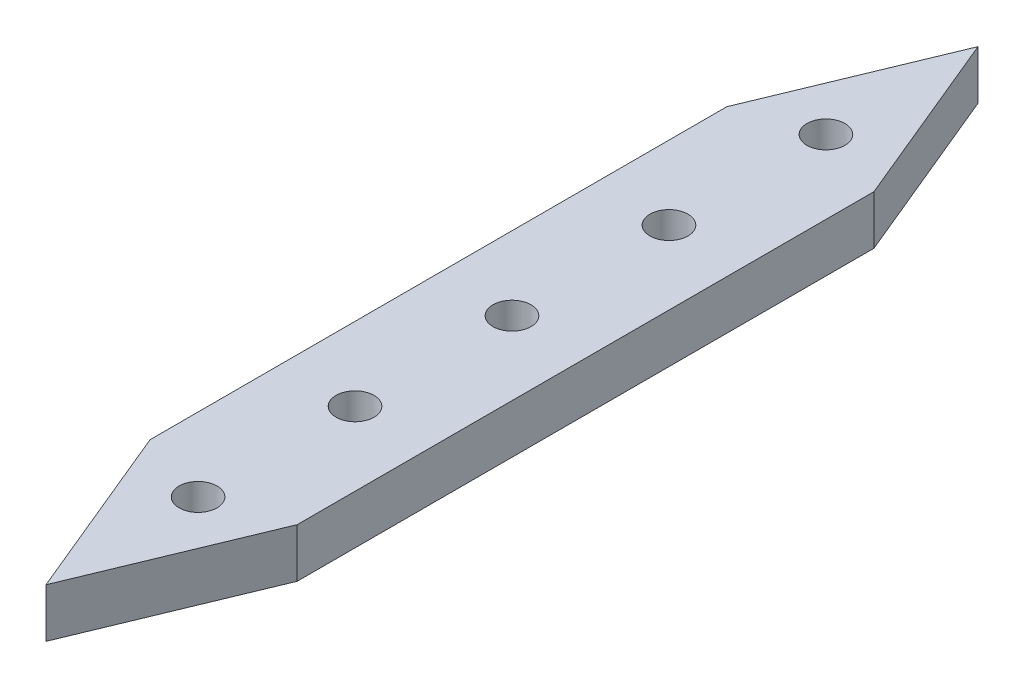
ISO-10303-21;
HEADER;
FILE_DESCRIPTION(('STEP AP214'),'2;1');
FILE_NAME('part.step','',(''),(''),'','','');
FILE_SCHEMA(('AUTOMOTIVE_DESIGN { 1 0 10303 214 1 1 1 1 }'));
ENDSEC;
DATA;
#1=APPLICATION_CONTEXT('core data for automotive mechanical design processes');
#2=APPLICATION_PROTOCOL_DEFINITION('international standard','automotive_design',2000,#1);
#3=PRODUCT_CONTEXT('',#1,'mechanical');
#4=PRODUCT('Part','Part','',(#3));
#5=PRODUCT_RELATED_PRODUCT_CATEGORY('part','',(#4));
#6=PRODUCT_DEFINITION_FORMATION('','',#4);
#7=PRODUCT_DEFINITION_CONTEXT('part definition',#1,'design');
#8=PRODUCT_DEFINITION('design','',#6,#7);
#9=PRODUCT_DEFINITION_SHAPE('','',#8);
#10=(LENGTH_UNIT() NAMED_UNIT(*) SI_UNIT(.MILLI.,.METRE.));
#11=(NAMED_UNIT(*) PLANE_ANGLE_UNIT() SI_UNIT($,.RADIAN.));
#12=(NAMED_UNIT(*) SI_UNIT($,.STERADIAN.) SOLID_ANGLE_UNIT());
#13=UNCERTAINTY_MEASURE_WITH_UNIT(LENGTH_MEASURE(1.E-05),#10,'distance_accuracy_value','');
#14=(GEOMETRIC_REPRESENTATION_CONTEXT(3) GLOBAL_UNCERTAINTY_ASSIGNED_CONTEXT((#13)) GLOBAL_UNIT_ASSIGNED_CONTEXT((#10,
#11,#12)) REPRESENTATION_CONTEXT('',''));
#15=CARTESIAN_POINT('',(0.,0.,0.));
#16=DIRECTION('',(0.,0.,1.));
#17=DIRECTION('',(1.,0.,0.));
#18=AXIS2_PLACEMENT_3D('',#15,#16,#17);
#19=CARTESIAN_POINT('',(0.,6.35,-60.325));
#20=DIRECTION('',(-0.923879532511286,0.,0.382683432365091));
#21=DIRECTION('',(0.382683432365091,0.,0.923879532511286));
#22=AXIS2_PLACEMENT_3D('',#19,#20,#21);
#23=PLANE('',#22);
#24=DIRECTION('',(-0.382683432365091,0.,-0.923879532511286));
#25=VECTOR('',#24,1.);
#26=CARTESIAN_POINT('',(0.,0.,-60.325));
#27=LINE('',#26,#25);
#28=CARTESIAN_POINT('',(9.52499999999999,0.,-37.3296158183964));
#29=VERTEX_POINT('',#28);
#30=CARTESIAN_POINT('',(0.,0.,-60.325));
#31=VERTEX_POINT('',#30);
#32=EDGE_CURVE('E121',#29,#31,#27,.T.);
#33=ORIENTED_EDGE('',*,*,#32,.T.);
#34=DIRECTION('',(0.,-1.,0.));
#35=VECTOR('',#34,1.);
#36=CARTESIAN_POINT('',(0.,6.35,-60.325));
#37=LINE('',#36,#35);
#38=CARTESIAN_POINT('',(0.,6.35,-60.325));
#39=VERTEX_POINT('',#38);
#40=EDGE_CURVE('E11',#39,#31,#37,.T.);
#41=ORIENTED_EDGE('',*,*,#40,.F.);
#42=DIRECTION('',(-0.382683432365091,0.,-0.923879532511286));
#43=VECTOR('',#42,1.);
#44=CARTESIAN_POINT('',(0.,6.35,-60.325));
#45=LINE('',#44,#43);
#46=CARTESIAN_POINT('',(9.52499999999999,6.35,-37.3296158183964));
#47=VERTEX_POINT('',#46);
#48=EDGE_CURVE('E132',#47,#39,#45,.T.);
#49=ORIENTED_EDGE('',*,*,#48,.F.);
#50=DIRECTION('',(0.,-1.,0.));
#51=VECTOR('',#50,1.);
#52=CARTESIAN_POINT('',(9.52499999999999,6.35,-37.3296158183964));
#53=LINE('',#52,#51);
#54=EDGE_CURVE('E117',#47,#29,#53,.T.);
#55=ORIENTED_EDGE('',*,*,#54,.T.);
#56=EDGE_LOOP('',(#33,#41,#49,#55));
#57=FACE_BOUND('',#56,.T.);
#58=ADVANCED_FACE('F37',(#57),#23,.F.);
#59=CARTESIAN_POINT('',(0.,6.35,-60.325));
#60=DIRECTION('',(0.923879532511286,0.,0.382683432365091));
#61=DIRECTION('',(0.382683432365091,0.,-0.923879532511286));
#62=AXIS2_PLACEMENT_3D('',#59,#60,#61);
#63=PLANE('',#62);
#64=DIRECTION('',(-0.382683432365091,0.,0.923879532511286));
#65=VECTOR('',#64,1.);
#66=CARTESIAN_POINT('',(0.,0.,-60.325));
#67=LINE('',#66,#65);
#68=CARTESIAN_POINT('',(-9.52499999999998,0.,-37.3296158183964));
#69=VERTEX_POINT('',#68);
#70=EDGE_CURVE('E124',#31,#69,#67,.T.);
#71=ORIENTED_EDGE('',*,*,#70,.T.);
#72=DIRECTION('',(0.,-1.,0.));
#73=VECTOR('',#72,1.);
#74=CARTESIAN_POINT('',(-9.52499999999998,6.35,-37.3296158183964));
#75=LINE('',#74,#73);
#76=CARTESIAN_POINT('',(-9.52499999999998,6.35,-37.3296158183964));
#77=VERTEX_POINT('',#76);
#78=EDGE_CURVE('E45',#77,#69,#75,.T.);
#79=ORIENTED_EDGE('',*,*,#78,.F.);
#80=DIRECTION('',(-0.382683432365091,0.,0.923879532511286));
#81=VECTOR('',#80,1.);
#82=CARTESIAN_POINT('',(0.,6.35,-60.325));
#83=LINE('',#82,#81);
#84=EDGE_CURVE('E90',#39,#77,#83,.T.);
#85=ORIENTED_EDGE('',*,*,#84,.F.);
#86=ORIENTED_EDGE('',*,*,#40,.T.);
#87=EDGE_LOOP('',(#71,#79,#85,#86));
#88=FACE_BOUND('',#87,.T.);
#89=ADVANCED_FACE('F157',(#88),#63,.F.);
#90=CARTESIAN_POINT('',(-9.52499999999998,6.35,-37.3296158183964));
#91=DIRECTION('',(1.,0.,0.));
#92=DIRECTION('',(0.,0.,-1.));
#93=AXIS2_PLACEMENT_3D('',#90,#91,#92);
#94=PLANE('',#93);
#95=DIRECTION('',(0.,0.,1.));
#96=VECTOR('',#95,1.);
#97=CARTESIAN_POINT('',(-9.52499999999998,0.,-37.3296158183964));
#98=LINE('',#97,#96);
#99=CARTESIAN_POINT('',(-9.52499999999998,0.,37.3296158183964));
#100=VERTEX_POINT('',#99);
#101=EDGE_CURVE('E127',#69,#100,#98,.T.);
#102=ORIENTED_EDGE('',*,*,#101,.T.);
#103=DIRECTION('',(0.,-1.,0.));
#104=VECTOR('',#103,1.);
#105=CARTESIAN_POINT('',(-9.52499999999998,6.35,37.3296158183964));
#106=LINE('',#105,#104);
#107=CARTESIAN_POINT('',(-9.52499999999998,6.35,37.3296158183964));
#108=VERTEX_POINT('',#107);
#109=EDGE_CURVE('E112',#108,#100,#106,.T.);
#110=ORIENTED_EDGE('',*,*,#109,.F.);
#111=DIRECTION('',(0.,0.,1.));
#112=VECTOR('',#111,1.);
#113=CARTESIAN_POINT('',(-9.52499999999998,6.35,-37.3296158183964));
#114=LINE('',#113,#112);
#115=EDGE_CURVE('E103',#77,#108,#114,.T.);
#116=ORIENTED_EDGE('',*,*,#115,.F.);
#117=ORIENTED_EDGE('',*,*,#78,.T.);
#118=EDGE_LOOP('',(#102,#110,#116,#117));
#119=FACE_BOUND('',#118,.T.);
#120=ADVANCED_FACE('F138',(#119),#94,.F.);
#121=CARTESIAN_POINT('',(0.,6.35,60.325));
#122=DIRECTION('',(0.923879532511286,0.,-0.382683432365091));
#123=DIRECTION('',(-0.382683432365091,0.,-0.923879532511286));
#124=AXIS2_PLACEMENT_3D('',#121,#122,#123);
#125=PLANE('',#124);
#126=DIRECTION('',(0.382683432365091,0.,0.923879532511286));
#127=VECTOR('',#126,1.);
#128=CARTESIAN_POINT('',(0.,0.,60.325));
#129=LINE('',#128,#127);
#130=CARTESIAN_POINT('',(0.,0.,60.325));
#131=VERTEX_POINT('',#130);
#132=EDGE_CURVE('E111',#100,#131,#129,.T.);
#133=ORIENTED_EDGE('',*,*,#132,.T.);
#134=DIRECTION('',(0.,-1.,0.));
#135=VECTOR('',#134,1.);
#136=CARTESIAN_POINT('',(0.,6.35,60.325));
#137=LINE('',#136,#135);
#138=CARTESIAN_POINT('',(0.,6.35,60.325));
#139=VERTEX_POINT('',#138);
#140=EDGE_CURVE('E108',#139,#131,#137,.T.);
#141=ORIENTED_EDGE('',*,*,#140,.F.);
#142=DIRECTION('',(0.382683432365091,0.,0.923879532511286));
#143=VECTOR('',#142,1.);
#144=CARTESIAN_POINT('',(0.,6.35,60.325));
#145=LINE('',#144,#143);
#146=EDGE_CURVE('E97',#108,#139,#145,.T.);
#147=ORIENTED_EDGE('',*,*,#146,.F.);
#148=ORIENTED_EDGE('',*,*,#109,.T.);
#149=EDGE_LOOP('',(#133,#141,#147,#148));
#150=FACE_BOUND('',#149,.T.);
#151=ADVANCED_FACE('F109',(#150),#125,.F.);
#152=CARTESIAN_POINT('',(0.,6.35,60.325));
#153=DIRECTION('',(-0.923879532511286,0.,-0.382683432365091));
#154=DIRECTION('',(-0.382683432365091,0.,0.923879532511286));
#155=AXIS2_PLACEMENT_3D('',#152,#153,#154);
#156=PLANE('',#155);
#157=DIRECTION('',(0.382683432365091,0.,-0.923879532511286));
#158=VECTOR('',#157,1.);
#159=CARTESIAN_POINT('',(0.,0.,60.325));
#160=LINE('',#159,#158);
#161=CARTESIAN_POINT('',(9.52499999999999,0.,37.3296158183964));
#162=VERTEX_POINT('',#161);
#163=EDGE_CURVE('E76',#131,#162,#160,.T.);
#164=ORIENTED_EDGE('',*,*,#163,.T.);
#165=DIRECTION('',(0.,-1.,0.));
#166=VECTOR('',#165,1.);
#167=CARTESIAN_POINT('',(9.52499999999999,6.35,37.3296158183964));
#168=LINE('',#167,#166);
#169=CARTESIAN_POINT('',(9.52499999999999,6.35,37.3296158183964));
#170=VERTEX_POINT('',#169);
#171=EDGE_CURVE('E113',#170,#162,#168,.T.);
#172=ORIENTED_EDGE('',*,*,#171,.F.);
#173=DIRECTION('',(0.382683432365091,0.,-0.923879532511286));
#174=VECTOR('',#173,1.);
#175=CARTESIAN_POINT('',(0.,6.35,60.325));
#176=LINE('',#175,#174);
#177=EDGE_CURVE('E101',#139,#170,#176,.T.);
#178=ORIENTED_EDGE('',*,*,#177,.F.);
#179=ORIENTED_EDGE('',*,*,#140,.T.);
#180=EDGE_LOOP('',(#164,#172,#178,#179));
#181=FACE_BOUND('',#180,.T.);
#182=ADVANCED_FACE('F115',(#181),#156,.F.);
#183=CARTESIAN_POINT('',(9.52499999999999,6.35,-37.3296158183964));
#184=DIRECTION('',(-1.,0.,0.));
#185=DIRECTION('',(0.,0.,1.));
#186=AXIS2_PLACEMENT_3D('',#183,#184,#185);
#187=PLANE('',#186);
#188=DIRECTION('',(0.,0.,-1.));
#189=VECTOR('',#188,1.);
#190=CARTESIAN_POINT('',(9.52499999999999,0.,-37.3296158183964));
#191=LINE('',#190,#189);
#192=EDGE_CURVE('E82',#162,#29,#191,.T.);
#193=ORIENTED_EDGE('',*,*,#192,.T.);
#194=ORIENTED_EDGE('',*,*,#54,.F.);
#195=DIRECTION('',(0.,0.,-1.));
#196=VECTOR('',#195,1.);
#197=CARTESIAN_POINT('',(9.52499999999999,6.35,-37.3296158183964));
#198=LINE('',#197,#196);
#199=EDGE_CURVE('E53',#170,#47,#198,.T.);
#200=ORIENTED_EDGE('',*,*,#199,.F.);
#201=ORIENTED_EDGE('',*,*,#171,.T.);
#202=EDGE_LOOP('',(#193,#194,#200,#201));
#203=FACE_BOUND('',#202,.T.);
#204=ADVANCED_FACE('F145',(#203),#187,.F.);
#205=CARTESIAN_POINT('',(0.,6.35,0.));
#206=DIRECTION('',(0.,1.,0.));
#207=DIRECTION('',(0.,0.,1.));
#208=AXIS2_PLACEMENT_3D('',#205,#206,#207);
#209=PLANE('',#208);
#210=CARTESIAN_POINT('',(0.,6.35,-20.32));
#211=DIRECTION('',(0.,1.,0.));
#212=DIRECTION('',(0.,0.,1.));
#213=AXIS2_PLACEMENT_3D('',#210,#211,#212);
#214=CIRCLE('',#213,2.45745);
#215=CARTESIAN_POINT('',(0.,6.35,-17.86255));
#216=VERTEX_POINT('',#215);
#217=EDGE_CURVE('E263',#216,#216,#214,.T.);
#218=ORIENTED_EDGE('',*,*,#217,.F.);
#219=EDGE_LOOP('',(#218));
#220=FACE_BOUND('',#219,.T.);
#221=CARTESIAN_POINT('',(0.,6.35,-40.64));
#222=DIRECTION('',(0.,1.,0.));
#223=DIRECTION('',(0.,0.,1.));
#224=AXIS2_PLACEMENT_3D('',#221,#222,#223);
#225=CIRCLE('',#224,2.45745);
#226=CARTESIAN_POINT('',(0.,6.35,-38.18255));
#227=VERTEX_POINT('',#226);
#228=EDGE_CURVE('E265',#227,#227,#225,.T.);
#229=ORIENTED_EDGE('',*,*,#228,.F.);
#230=EDGE_LOOP('',(#229));
#231=FACE_BOUND('',#230,.T.);
#232=CARTESIAN_POINT('',(0.,6.35,0.));
#233=DIRECTION('',(0.,1.,0.));
#234=DIRECTION('',(0.,0.,1.));
#235=AXIS2_PLACEMENT_3D('',#232,#233,#234);
#236=CIRCLE('',#235,2.45745);
#237=CARTESIAN_POINT('',(0.,6.35,2.45745));
#238=VERTEX_POINT('',#237);
#239=EDGE_CURVE('E273',#238,#238,#236,.T.);
#240=ORIENTED_EDGE('',*,*,#239,.F.);
#241=EDGE_LOOP('',(#240));
#242=FACE_BOUND('',#241,.T.);
#243=CARTESIAN_POINT('',(0.,6.35,20.32));
#244=DIRECTION('',(0.,1.,0.));
#245=DIRECTION('',(0.,0.,1.));
#246=AXIS2_PLACEMENT_3D('',#243,#244,#245);
#247=CIRCLE('',#246,2.45745);
#248=CARTESIAN_POINT('',(0.,6.35,22.77745));
#249=VERTEX_POINT('',#248);
#250=EDGE_CURVE('E279',#249,#249,#247,.T.);
#251=ORIENTED_EDGE('',*,*,#250,.F.);
#252=EDGE_LOOP('',(#251));
#253=FACE_BOUND('',#252,.T.);
#254=CARTESIAN_POINT('',(0.,6.35,40.64));
#255=DIRECTION('',(0.,1.,0.));
#256=DIRECTION('',(0.,0.,1.));
#257=AXIS2_PLACEMENT_3D('',#254,#255,#256);
#258=CIRCLE('',#257,2.45745);
#259=CARTESIAN_POINT('',(0.,6.35,43.09745));
#260=VERTEX_POINT('',#259);
#261=EDGE_CURVE('E285',#260,#260,#258,.T.);
#262=ORIENTED_EDGE('',*,*,#261,.F.);
#263=EDGE_LOOP('',(#262));
#264=FACE_BOUND('',#263,.T.);
#265=ORIENTED_EDGE('',*,*,#48,.T.);
#266=ORIENTED_EDGE('',*,*,#84,.T.);
#267=ORIENTED_EDGE('',*,*,#115,.T.);
#268=ORIENTED_EDGE('',*,*,#146,.T.);
#269=ORIENTED_EDGE('',*,*,#177,.T.);
#270=ORIENTED_EDGE('',*,*,#199,.T.);
#271=EDGE_LOOP('',(#265,#266,#267,#268,#269,#270));
#272=FACE_BOUND('',#271,.T.);
#273=ADVANCED_FACE('F99',(#220,#231,#242,#253,#264,#272),#209,.T.);
#274=CARTESIAN_POINT('',(0.,0.,0.));
#275=DIRECTION('',(0.,1.,0.));
#276=DIRECTION('',(0.,0.,1.));
#277=AXIS2_PLACEMENT_3D('',#274,#275,#276);
#278=PLANE('',#277);
#279=CARTESIAN_POINT('',(0.,0.,-20.32));
#280=DIRECTION('',(0.,1.,0.));
#281=DIRECTION('',(0.,0.,1.));
#282=AXIS2_PLACEMENT_3D('',#279,#280,#281);
#283=CIRCLE('',#282,2.45745);
#284=CARTESIAN_POINT('',(0.,0.,-17.86255));
#285=VERTEX_POINT('',#284);
#286=EDGE_CURVE('E260',#285,#285,#283,.T.);
#287=ORIENTED_EDGE('',*,*,#286,.T.);
#288=EDGE_LOOP('',(#287));
#289=FACE_BOUND('',#288,.T.);
#290=CARTESIAN_POINT('',(0.,0.,-40.64));
#291=DIRECTION('',(0.,1.,0.));
#292=DIRECTION('',(0.,0.,1.));
#293=AXIS2_PLACEMENT_3D('',#290,#291,#292);
#294=CIRCLE('',#293,2.45745);
#295=CARTESIAN_POINT('',(0.,0.,-38.18255));
#296=VERTEX_POINT('',#295);
#297=EDGE_CURVE('E270',#296,#296,#294,.T.);
#298=ORIENTED_EDGE('',*,*,#297,.T.);
#299=EDGE_LOOP('',(#298));
#300=FACE_BOUND('',#299,.T.);
#301=CARTESIAN_POINT('',(0.,0.,0.));
#302=DIRECTION('',(0.,1.,0.));
#303=DIRECTION('',(0.,0.,1.));
#304=AXIS2_PLACEMENT_3D('',#301,#302,#303);
#305=CIRCLE('',#304,2.45745);
#306=CARTESIAN_POINT('',(0.,0.,2.45745));
#307=VERTEX_POINT('',#306);
#308=EDGE_CURVE('E276',#307,#307,#305,.T.);
#309=ORIENTED_EDGE('',*,*,#308,.T.);
#310=EDGE_LOOP('',(#309));
#311=FACE_BOUND('',#310,.T.);
#312=CARTESIAN_POINT('',(0.,0.,20.32));
#313=DIRECTION('',(0.,1.,0.));
#314=DIRECTION('',(0.,0.,1.));
#315=AXIS2_PLACEMENT_3D('',#312,#313,#314);
#316=CIRCLE('',#315,2.45745);
#317=CARTESIAN_POINT('',(0.,0.,22.77745));
#318=VERTEX_POINT('',#317);
#319=EDGE_CURVE('E282',#318,#318,#316,.T.);
#320=ORIENTED_EDGE('',*,*,#319,.T.);
#321=EDGE_LOOP('',(#320));
#322=FACE_BOUND('',#321,.T.);
#323=CARTESIAN_POINT('',(0.,0.,40.64));
#324=DIRECTION('',(0.,1.,0.));
#325=DIRECTION('',(0.,0.,1.));
#326=AXIS2_PLACEMENT_3D('',#323,#324,#325);
#327=CIRCLE('',#326,2.45745);
#328=CARTESIAN_POINT('',(0.,0.,43.09745));
#329=VERTEX_POINT('',#328);
#330=EDGE_CURVE('E125',#329,#329,#327,.T.);
#331=ORIENTED_EDGE('',*,*,#330,.T.);
#332=EDGE_LOOP('',(#331));
#333=FACE_BOUND('',#332,.T.);
#334=ORIENTED_EDGE('',*,*,#32,.F.);
#335=ORIENTED_EDGE('',*,*,#192,.F.);
#336=ORIENTED_EDGE('',*,*,#163,.F.);
#337=ORIENTED_EDGE('',*,*,#132,.F.);
#338=ORIENTED_EDGE('',*,*,#101,.F.);
#339=ORIENTED_EDGE('',*,*,#70,.F.);
#340=EDGE_LOOP('',(#334,#335,#336,#337,#338,#339));
#341=FACE_BOUND('',#340,.T.);
#342=ADVANCED_FACE('F141',(#289,#300,#311,#322,#333,#341),#278,.F.);
#343=CARTESIAN_POINT('',(0.,6.35,40.64));
#344=DIRECTION('',(0.,1.,0.));
#345=DIRECTION('',(0.,0.,1.));
#346=AXIS2_PLACEMENT_3D('',#343,#344,#345);
#347=CYLINDRICAL_SURFACE('',#346,2.45745);
#348=ORIENTED_EDGE('',*,*,#330,.F.);
#349=EDGE_LOOP('',(#348));
#350=FACE_BOUND('',#349,.T.);
#351=ORIENTED_EDGE('',*,*,#261,.T.);
#352=EDGE_LOOP('',(#351));
#353=FACE_BOUND('',#352,.T.);
#354=ADVANCED_FACE('F194',(#350,#353),#347,.F.);
#355=CARTESIAN_POINT('',(0.,6.35,20.32));
#356=DIRECTION('',(0.,1.,0.));
#357=DIRECTION('',(0.,0.,1.));
#358=AXIS2_PLACEMENT_3D('',#355,#356,#357);
#359=CYLINDRICAL_SURFACE('',#358,2.45745);
#360=ORIENTED_EDGE('',*,*,#319,.F.);
#361=EDGE_LOOP('',(#360));
#362=FACE_BOUND('',#361,.T.);
#363=ORIENTED_EDGE('',*,*,#250,.T.);
#364=EDGE_LOOP('',(#363));
#365=FACE_BOUND('',#364,.T.);
#366=ADVANCED_FACE('F204',(#362,#365),#359,.F.);
#367=CARTESIAN_POINT('',(0.,6.35,0.));
#368=DIRECTION('',(0.,1.,0.));
#369=DIRECTION('',(0.,0.,1.));
#370=AXIS2_PLACEMENT_3D('',#367,#368,#369);
#371=CYLINDRICAL_SURFACE('',#370,2.45745);
#372=ORIENTED_EDGE('',*,*,#308,.F.);
#373=EDGE_LOOP('',(#372));
#374=FACE_BOUND('',#373,.T.);
#375=ORIENTED_EDGE('',*,*,#239,.T.);
#376=EDGE_LOOP('',(#375));
#377=FACE_BOUND('',#376,.T.);
#378=ADVANCED_FACE('F216',(#374,#377),#371,.F.);
#379=CARTESIAN_POINT('',(0.,6.35,-40.64));
#380=DIRECTION('',(0.,1.,0.));
#381=DIRECTION('',(0.,0.,1.));
#382=AXIS2_PLACEMENT_3D('',#379,#380,#381);
#383=CYLINDRICAL_SURFACE('',#382,2.45745);
#384=ORIENTED_EDGE('',*,*,#297,.F.);
#385=EDGE_LOOP('',(#384));
#386=FACE_BOUND('',#385,.T.);
#387=ORIENTED_EDGE('',*,*,#228,.T.);
#388=EDGE_LOOP('',(#387));
#389=FACE_BOUND('',#388,.T.);
#390=ADVANCED_FACE('F227',(#386,#389),#383,.F.);
#391=CARTESIAN_POINT('',(0.,6.35,-20.32));
#392=DIRECTION('',(0.,1.,0.));
#393=DIRECTION('',(0.,0.,1.));
#394=AXIS2_PLACEMENT_3D('',#391,#392,#393);
#395=CYLINDRICAL_SURFACE('',#394,2.45745);
#396=ORIENTED_EDGE('',*,*,#286,.F.);
#397=EDGE_LOOP('',(#396));
#398=FACE_BOUND('',#397,.T.);
#399=ORIENTED_EDGE('',*,*,#217,.T.);
#400=EDGE_LOOP('',(#399));
#401=FACE_BOUND('',#400,.T.);
#402=ADVANCED_FACE('F238',(#398,#401),#395,.F.);
#403=CLOSED_SHELL('',(#58,#89,#120,#151,#182,#204,#273,#342,#354,#366,#378,#390,#402));
#404=MANIFOLD_SOLID_BREP('B2',#403);
#405=ADVANCED_BREP_SHAPE_REPRESENTATION('',(#18,#404),#14);
#406=SHAPE_DEFINITION_REPRESENTATION(#9,#405);
ENDSEC;
END-ISO-10303-21;
